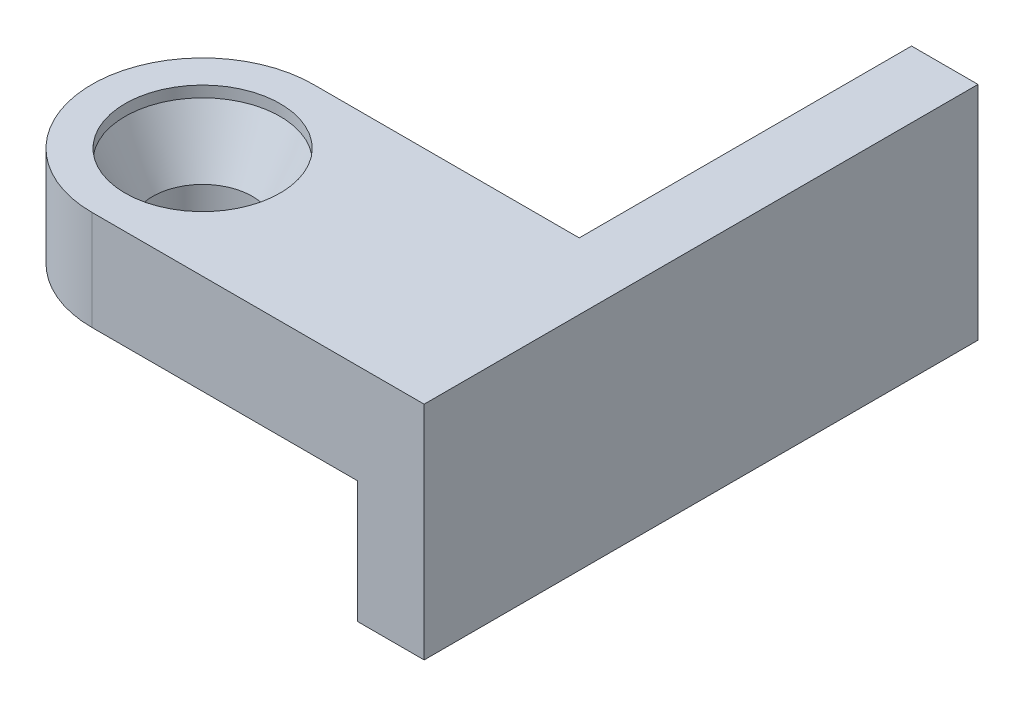
ISO-10303-21;
HEADER;
FILE_DESCRIPTION(('STEP AP214'),'2;1');
FILE_NAME('part.step','',(''),(''),'','','');
FILE_SCHEMA(('AUTOMOTIVE_DESIGN { 1 0 10303 214 1 1 1 1 }'));
ENDSEC;
DATA;
#1=APPLICATION_CONTEXT('core data for automotive mechanical design processes');
#2=APPLICATION_PROTOCOL_DEFINITION('international standard','automotive_design',2000,#1);
#3=PRODUCT_CONTEXT('',#1,'mechanical');
#4=PRODUCT('Part','Part','',(#3));
#5=PRODUCT_RELATED_PRODUCT_CATEGORY('part','',(#4));
#6=PRODUCT_DEFINITION_FORMATION('','',#4);
#7=PRODUCT_DEFINITION_CONTEXT('part definition',#1,'design');
#8=PRODUCT_DEFINITION('design','',#6,#7);
#9=PRODUCT_DEFINITION_SHAPE('','',#8);
#10=(LENGTH_UNIT() NAMED_UNIT(*) SI_UNIT(.MILLI.,.METRE.));
#11=(NAMED_UNIT(*) PLANE_ANGLE_UNIT() SI_UNIT($,.RADIAN.));
#12=(NAMED_UNIT(*) SI_UNIT($,.STERADIAN.) SOLID_ANGLE_UNIT());
#13=UNCERTAINTY_MEASURE_WITH_UNIT(LENGTH_MEASURE(1.E-05),#10,'distance_accuracy_value','');
#14=(GEOMETRIC_REPRESENTATION_CONTEXT(3) GLOBAL_UNCERTAINTY_ASSIGNED_CONTEXT((#13)) GLOBAL_UNIT_ASSIGNED_CONTEXT((#10,
#11,#12)) REPRESENTATION_CONTEXT('',''));
#15=CARTESIAN_POINT('',(0.,0.,0.));
#16=DIRECTION('',(0.,0.,1.));
#17=DIRECTION('',(1.,0.,0.));
#18=AXIS2_PLACEMENT_3D('',#15,#16,#17);
#19=CARTESIAN_POINT('',(0.,4.5,0.));
#20=DIRECTION('',(0.,-1.,0.));
#21=DIRECTION('',(0.,0.,-1.));
#22=AXIS2_PLACEMENT_3D('',#19,#20,#21);
#23=CYLINDRICAL_SURFACE('',#22,2.25);
#24=CARTESIAN_POINT('',(0.,0.,0.));
#25=DIRECTION('',(0.,1.,0.));
#26=DIRECTION('',(0.,0.,1.));
#27=AXIS2_PLACEMENT_3D('',#24,#25,#26);
#28=CIRCLE('',#27,2.25);
#29=CARTESIAN_POINT('',(0.,0.,2.25));
#30=VERTEX_POINT('',#29);
#31=EDGE_CURVE('E135',#30,#30,#28,.T.);
#32=ORIENTED_EDGE('',*,*,#31,.F.);
#33=EDGE_LOOP('',(#32));
#34=FACE_BOUND('',#33,.T.);
#35=CARTESIAN_POINT('',(0.,1.5,0.));
#36=DIRECTION('',(0.,1.,0.));
#37=DIRECTION('',(0.,0.,1.));
#38=AXIS2_PLACEMENT_3D('',#35,#36,#37);
#39=CIRCLE('',#38,2.25);
#40=CARTESIAN_POINT('',(0.,1.5,2.25));
#41=VERTEX_POINT('',#40);
#42=EDGE_CURVE('E127',#41,#41,#39,.T.);
#43=ORIENTED_EDGE('',*,*,#42,.T.);
#44=EDGE_LOOP('',(#43));
#45=FACE_BOUND('',#44,.T.);
#46=ADVANCED_FACE('F35',(#34,#45),#23,.F.);
#47=CARTESIAN_POINT('',(0.,0.,0.));
#48=DIRECTION('',(0.,1.,0.));
#49=DIRECTION('',(0.,0.,1.));
#50=AXIS2_PLACEMENT_3D('',#47,#48,#49);
#51=PLANE('',#50);
#52=ORIENTED_EDGE('',*,*,#31,.T.);
#53=EDGE_LOOP('',(#52));
#54=FACE_BOUND('',#53,.T.);
#55=DIRECTION('',(0.,0.,-1.));
#56=VECTOR('',#55,1.);
#57=CARTESIAN_POINT('',(12.,0.,0.));
#58=LINE('',#57,#56);
#59=CARTESIAN_POINT('',(12.,0.,5.));
#60=VERTEX_POINT('',#59);
#61=CARTESIAN_POINT('',(12.,0.,-5.));
#62=VERTEX_POINT('',#61);
#63=EDGE_CURVE('E51',#60,#62,#58,.T.);
#64=ORIENTED_EDGE('',*,*,#63,.F.);
#65=DIRECTION('',(1.,0.,0.));
#66=VECTOR('',#65,1.);
#67=CARTESIAN_POINT('',(15.,0.,5.));
#68=LINE('',#67,#66);
#69=CARTESIAN_POINT('',(0.,0.,5.));
#70=VERTEX_POINT('',#69);
#71=EDGE_CURVE('E103',#70,#60,#68,.T.);
#72=ORIENTED_EDGE('',*,*,#71,.F.);
#73=CARTESIAN_POINT('',(0.,0.,0.));
#74=DIRECTION('',(0.,1.,0.));
#75=DIRECTION('',(0.,0.,1.));
#76=AXIS2_PLACEMENT_3D('',#73,#74,#75);
#77=CIRCLE('',#76,5.);
#78=CARTESIAN_POINT('',(0.,0.,-5.));
#79=VERTEX_POINT('',#78);
#80=EDGE_CURVE('E138',#79,#70,#77,.T.);
#81=ORIENTED_EDGE('',*,*,#80,.F.);
#82=DIRECTION('',(-1.,0.,0.));
#83=VECTOR('',#82,1.);
#84=CARTESIAN_POINT('',(0.,0.,-5.));
#85=LINE('',#84,#83);
#86=EDGE_CURVE('E143',#62,#79,#85,.T.);
#87=ORIENTED_EDGE('',*,*,#86,.F.);
#88=EDGE_LOOP('',(#64,#72,#81,#87));
#89=FACE_BOUND('',#88,.T.);
#90=ADVANCED_FACE('F177',(#54,#89),#51,.F.);
#91=CARTESIAN_POINT('',(0.,4.5,-5.));
#92=DIRECTION('',(0.,0.,1.));
#93=DIRECTION('',(1.,0.,0.));
#94=AXIS2_PLACEMENT_3D('',#91,#92,#93);
#95=PLANE('',#94);
#96=DIRECTION('',(0.,1.,0.));
#97=VECTOR('',#96,1.);
#98=CARTESIAN_POINT('',(12.,4.5,-5.));
#99=LINE('',#98,#97);
#100=CARTESIAN_POINT('',(12.,4.5,-5.));
#101=VERTEX_POINT('',#100);
#102=EDGE_CURVE('E44',#62,#101,#99,.T.);
#103=ORIENTED_EDGE('',*,*,#102,.F.);
#104=ORIENTED_EDGE('',*,*,#86,.T.);
#105=DIRECTION('',(0.,-1.,0.));
#106=VECTOR('',#105,1.);
#107=CARTESIAN_POINT('',(0.,4.5,-5.));
#108=LINE('',#107,#106);
#109=CARTESIAN_POINT('',(0.,4.5,-5.));
#110=VERTEX_POINT('',#109);
#111=EDGE_CURVE('E148',#110,#79,#108,.T.);
#112=ORIENTED_EDGE('',*,*,#111,.F.);
#113=DIRECTION('',(-1.,0.,0.));
#114=VECTOR('',#113,1.);
#115=CARTESIAN_POINT('',(0.,4.5,-5.));
#116=LINE('',#115,#114);
#117=EDGE_CURVE('E59',#101,#110,#116,.T.);
#118=ORIENTED_EDGE('',*,*,#117,.F.);
#119=EDGE_LOOP('',(#103,#104,#112,#118));
#120=FACE_BOUND('',#119,.T.);
#121=ADVANCED_FACE('F172',(#120),#95,.F.);
#122=CARTESIAN_POINT('',(0.,4.5,0.));
#123=DIRECTION('',(0.,1.,0.));
#124=DIRECTION('',(0.,0.,1.));
#125=AXIS2_PLACEMENT_3D('',#122,#123,#124);
#126=PLANE('',#125);
#127=CARTESIAN_POINT('',(0.,4.5,0.));
#128=DIRECTION('',(0.,1.,0.));
#129=DIRECTION('',(0.,0.,1.));
#130=AXIS2_PLACEMENT_3D('',#127,#128,#129);
#131=CIRCLE('',#130,3.5);
#132=CARTESIAN_POINT('',(0.,4.5,3.5));
#133=VERTEX_POINT('',#132);
#134=EDGE_CURVE('E160',#133,#133,#131,.T.);
#135=ORIENTED_EDGE('',*,*,#134,.F.);
#136=EDGE_LOOP('',(#135));
#137=FACE_BOUND('',#136,.T.);
#138=DIRECTION('',(0.,0.,-1.));
#139=VECTOR('',#138,1.);
#140=CARTESIAN_POINT('',(12.,4.5,5.));
#141=LINE('',#140,#139);
#142=CARTESIAN_POINT('',(12.,4.5,-20.));
#143=VERTEX_POINT('',#142);
#144=EDGE_CURVE('E115',#101,#143,#141,.T.);
#145=ORIENTED_EDGE('',*,*,#144,.F.);
#146=ORIENTED_EDGE('',*,*,#117,.T.);
#147=CARTESIAN_POINT('',(0.,4.5,0.));
#148=DIRECTION('',(0.,1.,0.));
#149=DIRECTION('',(0.,0.,1.));
#150=AXIS2_PLACEMENT_3D('',#147,#148,#149);
#151=CIRCLE('',#150,5.);
#152=CARTESIAN_POINT('',(0.,4.5,5.));
#153=VERTEX_POINT('',#152);
#154=EDGE_CURVE('E139',#110,#153,#151,.T.);
#155=ORIENTED_EDGE('',*,*,#154,.T.);
#156=DIRECTION('',(1.,0.,0.));
#157=VECTOR('',#156,1.);
#158=CARTESIAN_POINT('',(15.,4.5,5.));
#159=LINE('',#158,#157);
#160=CARTESIAN_POINT('',(15.,4.5,5.));
#161=VERTEX_POINT('',#160);
#162=EDGE_CURVE('E142',#153,#161,#159,.T.);
#163=ORIENTED_EDGE('',*,*,#162,.T.);
#164=DIRECTION('',(0.,0.,-1.));
#165=VECTOR('',#164,1.);
#166=CARTESIAN_POINT('',(15.,4.5,-5.));
#167=LINE('',#166,#165);
#168=CARTESIAN_POINT('',(15.,4.5,-20.));
#169=VERTEX_POINT('',#168);
#170=EDGE_CURVE('E145',#161,#169,#167,.T.);
#171=ORIENTED_EDGE('',*,*,#170,.T.);
#172=DIRECTION('',(1.,0.,0.));
#173=VECTOR('',#172,1.);
#174=CARTESIAN_POINT('',(12.,4.5,-20.));
#175=LINE('',#174,#173);
#176=EDGE_CURVE('E130',#143,#169,#175,.T.);
#177=ORIENTED_EDGE('',*,*,#176,.F.);
#178=EDGE_LOOP('',(#145,#146,#155,#163,#171,#177));
#179=FACE_BOUND('',#178,.T.);
#180=ADVANCED_FACE('F168',(#137,#179),#126,.T.);
#181=CARTESIAN_POINT('',(0.,4.5,0.));
#182=DIRECTION('',(0.,-1.,0.));
#183=DIRECTION('',(0.,0.,-1.));
#184=AXIS2_PLACEMENT_3D('',#181,#182,#183);
#185=CYLINDRICAL_SURFACE('',#184,5.);
#186=ORIENTED_EDGE('',*,*,#80,.T.);
#187=DIRECTION('',(0.,-1.,0.));
#188=VECTOR('',#187,1.);
#189=CARTESIAN_POINT('',(0.,4.5,5.));
#190=LINE('',#189,#188);
#191=EDGE_CURVE('E157',#153,#70,#190,.T.);
#192=ORIENTED_EDGE('',*,*,#191,.F.);
#193=ORIENTED_EDGE('',*,*,#154,.F.);
#194=ORIENTED_EDGE('',*,*,#111,.T.);
#195=EDGE_LOOP('',(#186,#192,#193,#194));
#196=FACE_BOUND('',#195,.T.);
#197=ADVANCED_FACE('F171',(#196),#185,.T.);
#198=CARTESIAN_POINT('',(15.,4.5,5.));
#199=DIRECTION('',(0.,0.,-1.));
#200=DIRECTION('',(-1.,0.,0.));
#201=AXIS2_PLACEMENT_3D('',#198,#199,#200);
#202=PLANE('',#201);
#203=DIRECTION('',(0.,-1.,0.));
#204=VECTOR('',#203,1.);
#205=CARTESIAN_POINT('',(15.,4.5,5.));
#206=LINE('',#205,#204);
#207=CARTESIAN_POINT('',(15.,-5.5,5.));
#208=VERTEX_POINT('',#207);
#209=EDGE_CURVE('E155',#161,#208,#206,.T.);
#210=ORIENTED_EDGE('',*,*,#209,.F.);
#211=ORIENTED_EDGE('',*,*,#162,.F.);
#212=ORIENTED_EDGE('',*,*,#191,.T.);
#213=ORIENTED_EDGE('',*,*,#71,.T.);
#214=DIRECTION('',(0.,-1.,0.));
#215=VECTOR('',#214,1.);
#216=CARTESIAN_POINT('',(12.,4.5,5.));
#217=LINE('',#216,#215);
#218=CARTESIAN_POINT('',(12.,-5.5,5.));
#219=VERTEX_POINT('',#218);
#220=EDGE_CURVE('E96',#60,#219,#217,.T.);
#221=ORIENTED_EDGE('',*,*,#220,.T.);
#222=DIRECTION('',(1.,0.,0.));
#223=VECTOR('',#222,1.);
#224=CARTESIAN_POINT('',(12.,-5.5,5.));
#225=LINE('',#224,#223);
#226=EDGE_CURVE('E100',#219,#208,#225,.T.);
#227=ORIENTED_EDGE('',*,*,#226,.T.);
#228=EDGE_LOOP('',(#210,#211,#212,#213,#221,#227));
#229=FACE_BOUND('',#228,.T.);
#230=ADVANCED_FACE('F99',(#229),#202,.F.);
#231=CARTESIAN_POINT('',(15.,4.5,-5.));
#232=DIRECTION('',(-1.,0.,0.));
#233=DIRECTION('',(0.,0.,1.));
#234=AXIS2_PLACEMENT_3D('',#231,#232,#233);
#235=PLANE('',#234);
#236=ORIENTED_EDGE('',*,*,#209,.T.);
#237=DIRECTION('',(0.,0.,-1.));
#238=VECTOR('',#237,1.);
#239=CARTESIAN_POINT('',(15.,-5.5,5.));
#240=LINE('',#239,#238);
#241=CARTESIAN_POINT('',(15.,-5.5,-20.));
#242=VERTEX_POINT('',#241);
#243=EDGE_CURVE('E113',#208,#242,#240,.T.);
#244=ORIENTED_EDGE('',*,*,#243,.T.);
#245=DIRECTION('',(0.,-1.,0.));
#246=VECTOR('',#245,1.);
#247=CARTESIAN_POINT('',(15.,4.5,-20.));
#248=LINE('',#247,#246);
#249=EDGE_CURVE('E107',#169,#242,#248,.T.);
#250=ORIENTED_EDGE('',*,*,#249,.F.);
#251=ORIENTED_EDGE('',*,*,#170,.F.);
#252=EDGE_LOOP('',(#236,#244,#250,#251));
#253=FACE_BOUND('',#252,.T.);
#254=ADVANCED_FACE('F184',(#253),#235,.F.);
#255=CARTESIAN_POINT('',(12.,0.,0.));
#256=DIRECTION('',(1.,0.,0.));
#257=DIRECTION('',(0.,0.,-1.));
#258=AXIS2_PLACEMENT_3D('',#255,#256,#257);
#259=PLANE('',#258);
#260=ORIENTED_EDGE('',*,*,#220,.F.);
#261=ORIENTED_EDGE('',*,*,#63,.T.);
#262=ORIENTED_EDGE('',*,*,#102,.T.);
#263=ORIENTED_EDGE('',*,*,#144,.T.);
#264=DIRECTION('',(0.,-1.,0.));
#265=VECTOR('',#264,1.);
#266=CARTESIAN_POINT('',(12.,4.5,-20.));
#267=LINE('',#266,#265);
#268=CARTESIAN_POINT('',(12.,-5.5,-20.));
#269=VERTEX_POINT('',#268);
#270=EDGE_CURVE('E119',#143,#269,#267,.T.);
#271=ORIENTED_EDGE('',*,*,#270,.T.);
#272=DIRECTION('',(0.,0.,-1.));
#273=VECTOR('',#272,1.);
#274=CARTESIAN_POINT('',(12.,-5.5,5.));
#275=LINE('',#274,#273);
#276=EDGE_CURVE('E106',#219,#269,#275,.T.);
#277=ORIENTED_EDGE('',*,*,#276,.F.);
#278=EDGE_LOOP('',(#260,#261,#262,#263,#271,#277));
#279=FACE_BOUND('',#278,.T.);
#280=ADVANCED_FACE('F117',(#279),#259,.F.);
#281=CARTESIAN_POINT('',(12.,4.5,-20.));
#282=DIRECTION('',(0.,0.,1.));
#283=DIRECTION('',(1.,0.,0.));
#284=AXIS2_PLACEMENT_3D('',#281,#282,#283);
#285=PLANE('',#284);
#286=ORIENTED_EDGE('',*,*,#249,.T.);
#287=DIRECTION('',(1.,0.,0.));
#288=VECTOR('',#287,1.);
#289=CARTESIAN_POINT('',(12.,-5.5,-20.));
#290=LINE('',#289,#288);
#291=EDGE_CURVE('E114',#269,#242,#290,.T.);
#292=ORIENTED_EDGE('',*,*,#291,.F.);
#293=ORIENTED_EDGE('',*,*,#270,.F.);
#294=ORIENTED_EDGE('',*,*,#176,.T.);
#295=EDGE_LOOP('',(#286,#292,#293,#294));
#296=FACE_BOUND('',#295,.T.);
#297=ADVANCED_FACE('F186',(#296),#285,.F.);
#298=CARTESIAN_POINT('',(12.,-5.5,5.));
#299=DIRECTION('',(0.,-1.,0.));
#300=DIRECTION('',(0.,0.,-1.));
#301=AXIS2_PLACEMENT_3D('',#298,#299,#300);
#302=PLANE('',#301);
#303=ORIENTED_EDGE('',*,*,#243,.F.);
#304=ORIENTED_EDGE('',*,*,#226,.F.);
#305=ORIENTED_EDGE('',*,*,#276,.T.);
#306=ORIENTED_EDGE('',*,*,#291,.T.);
#307=EDGE_LOOP('',(#303,#304,#305,#306));
#308=FACE_BOUND('',#307,.T.);
#309=ADVANCED_FACE('F111',(#308),#302,.T.);
#310=CARTESIAN_POINT('',(0.,1.5,0.));
#311=DIRECTION('',(0.,1.,0.));
#312=DIRECTION('',(0.,0.,1.));
#313=AXIS2_PLACEMENT_3D('',#310,#311,#312);
#314=CYLINDRICAL_SURFACE('',#313,3.5);
#315=CARTESIAN_POINT('',(0.,3.99999999999997,0.));
#316=DIRECTION('',(0.,1.,0.));
#317=DIRECTION('',(0.,0.,1.));
#318=AXIS2_PLACEMENT_3D('',#315,#316,#317);
#319=CIRCLE('',#318,3.5);
#320=CARTESIAN_POINT('',(0.,3.99999999999997,3.5));
#321=VERTEX_POINT('',#320);
#322=EDGE_CURVE('E11',#321,#321,#319,.F.);
#323=ORIENTED_EDGE('',*,*,#322,.T.);
#324=EDGE_LOOP('',(#323));
#325=FACE_BOUND('',#324,.T.);
#326=ORIENTED_EDGE('',*,*,#134,.T.);
#327=EDGE_LOOP('',(#326));
#328=FACE_BOUND('',#327,.T.);
#329=ADVANCED_FACE('F166',(#325,#328),#314,.F.);
#330=CARTESIAN_POINT('',(0.,1.5,0.));
#331=DIRECTION('',(0.,1.,0.));
#332=DIRECTION('',(0.,0.,1.));
#333=AXIS2_PLACEMENT_3D('',#330,#331,#332);
#334=CONICAL_SURFACE('',#333,2.25000000000001,0.463647609000808);
#335=ORIENTED_EDGE('',*,*,#322,.F.);
#336=EDGE_LOOP('',(#335));
#337=FACE_BOUND('',#336,.T.);
#338=ORIENTED_EDGE('',*,*,#42,.F.);
#339=EDGE_LOOP('',(#338));
#340=FACE_BOUND('',#339,.T.);
#341=ADVANCED_FACE('F38',(#337,#340),#334,.F.);
#342=CLOSED_SHELL('',(#46,#90,#121,#180,#197,#230,#254,#280,#297,#309,#329,#341));
#343=MANIFOLD_SOLID_BREP('B2',#342);
#344=ADVANCED_BREP_SHAPE_REPRESENTATION('',(#18,#343),#14);
#345=SHAPE_DEFINITION_REPRESENTATION(#9,#344);
ENDSEC;
END-ISO-10303-21;
